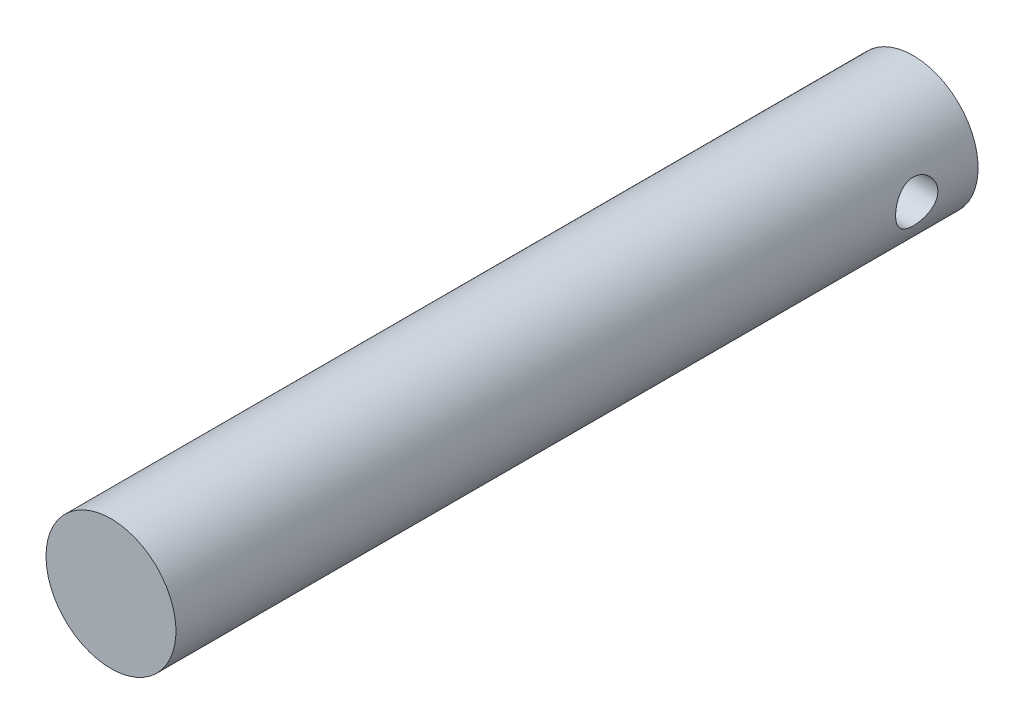
ISO-10303-21;
HEADER;
FILE_DESCRIPTION(('STEP AP214'),'2;1');
FILE_NAME('part.step','',(''),(''),'','','');
FILE_SCHEMA(('AUTOMOTIVE_DESIGN { 1 0 10303 214 1 1 1 1 }'));
ENDSEC;
DATA;
#1=APPLICATION_CONTEXT('core data for automotive mechanical design processes');
#2=APPLICATION_PROTOCOL_DEFINITION('international standard','automotive_design',2000,#1);
#3=PRODUCT_CONTEXT('',#1,'mechanical');
#4=PRODUCT('Part','Part','',(#3));
#5=PRODUCT_RELATED_PRODUCT_CATEGORY('part','',(#4));
#6=PRODUCT_DEFINITION_FORMATION('','',#4);
#7=PRODUCT_DEFINITION_CONTEXT('part definition',#1,'design');
#8=PRODUCT_DEFINITION('design','',#6,#7);
#9=PRODUCT_DEFINITION_SHAPE('','',#8);
#10=(LENGTH_UNIT() NAMED_UNIT(*) SI_UNIT(.MILLI.,.METRE.));
#11=(NAMED_UNIT(*) PLANE_ANGLE_UNIT() SI_UNIT($,.RADIAN.));
#12=(NAMED_UNIT(*) SI_UNIT($,.STERADIAN.) SOLID_ANGLE_UNIT());
#13=UNCERTAINTY_MEASURE_WITH_UNIT(LENGTH_MEASURE(1.E-05),#10,'distance_accuracy_value','');
#14=(GEOMETRIC_REPRESENTATION_CONTEXT(3) GLOBAL_UNCERTAINTY_ASSIGNED_CONTEXT((#13)) GLOBAL_UNIT_ASSIGNED_CONTEXT((#10,
#11,#12)) REPRESENTATION_CONTEXT('',''));
#15=CARTESIAN_POINT('',(0.,0.,0.));
#16=DIRECTION('',(0.,0.,1.));
#17=DIRECTION('',(1.,0.,0.));
#18=AXIS2_PLACEMENT_3D('',#15,#16,#17);
#19=CARTESIAN_POINT('',(27.0642201834863,0.458715596330286,9.45));
#20=DIRECTION('',(-1.,0.,0.));
#21=DIRECTION('',(0.,-1.,0.));
#22=AXIS2_PLACEMENT_3D('',#19,#20,#21);
#23=CYLINDRICAL_SURFACE('',#22,3.25);
#24=CARTESIAN_POINT('',(-7.3929199762026,-2.79128440366972,9.45));
#25=CARTESIAN_POINT('',(-7.39292013626799,-2.79128436961392,9.27270046901606));
#26=CARTESIAN_POINT('',(-7.39796043205219,-2.77672674277918,9.09539892094154));
#27=CARTESIAN_POINT('',(-7.4174787162544,-2.71906503754177,8.74603076756202));
#28=CARTESIAN_POINT('',(-7.43195865483701,-2.67595506039255,8.57396525167484));
#29=CARTESIAN_POINT('',(-7.46854666387884,-2.56284849130752,8.24018388203441));
#30=CARTESIAN_POINT('',(-7.49064037282979,-2.49290249098868,8.07844921766033));
#31=CARTESIAN_POINT('',(-7.53994601332036,-2.32828059755946,7.76896071185041));
#32=CARTESIAN_POINT('',(-7.56715898480589,-2.23359967818443,7.62120972029238));
#33=CARTESIAN_POINT('',(-7.62477158225799,-2.01842544778834,7.33838979785957));
#34=CARTESIAN_POINT('',(-7.65524773936334,-1.89716912063444,7.20391682889129));
#35=CARTESIAN_POINT('',(-7.71530418536026,-1.63391624861526,6.95681103287539));
#36=CARTESIAN_POINT('',(-7.74488433767103,-1.49191656079276,6.84418152149766));
#37=CARTESIAN_POINT('',(-7.80069763932119,-1.18688043163265,6.64128599405659));
#38=CARTESIAN_POINT('',(-7.82683024477067,-1.02341152173962,6.55164006185954));
#39=CARTESIAN_POINT('',(-7.87190555834753,-0.682720731607397,6.40135103812108));
#40=CARTESIAN_POINT('',(-7.89085010246542,-0.505502377230003,6.3407005394716));
#41=CARTESIAN_POINT('',(-7.91887282914443,-0.148588379133641,6.25213232094274));
#42=CARTESIAN_POINT('',(-7.92825772512036,0.0308296290530115,6.22319461868941));
#43=CARTESIAN_POINT('',(-7.93719023979821,0.392203558707344,6.19563491437338));
#44=CARTESIAN_POINT('',(-7.93674027185251,0.574158846606483,6.19700547504368));
#45=CARTESIAN_POINT('',(-7.92626393447129,0.928239367780362,6.22936664277708));
#46=CARTESIAN_POINT('',(-7.91659546846395,1.10047807927065,6.25925027520472));
#47=CARTESIAN_POINT('',(-7.8892141109913,1.43734784273191,6.34596450826688));
#48=CARTESIAN_POINT('',(-7.87150068184341,1.6019783854029,6.40279691002511));
#49=CARTESIAN_POINT('',(-7.82955392853232,1.92143319389194,6.54246788619951));
#50=CARTESIAN_POINT('',(-7.80524007839473,2.07610502757276,6.62562992090305));
#51=CARTESIAN_POINT('',(-7.75263597575973,2.36963252761695,6.81533589512239));
#52=CARTESIAN_POINT('',(-7.7243446577082,2.50848393762124,6.92188610458166));
#53=CARTESIAN_POINT('',(-7.66528087723099,2.77302109017597,7.16096532733197));
#54=CARTESIAN_POINT('',(-7.63445404645545,2.89783600569689,7.29444583071594));
#55=CARTESIAN_POINT('',(-7.57487468023917,3.12358249988415,7.58071709051935));
#56=CARTESIAN_POINT('',(-7.54612243286955,3.22451076613356,7.73351052060549));
#57=CARTESIAN_POINT('',(-7.49365937239887,3.40074497646327,8.0567074724905));
#58=CARTESIAN_POINT('',(-7.47001872572476,3.47570190236825,8.22731355803904));
#59=CARTESIAN_POINT('',(-7.43127175999179,3.59553653752626,8.57968467708717));
#60=CARTESIAN_POINT('',(-7.41616207482116,3.64042611193604,8.76144527785337));
#61=CARTESIAN_POINT('',(-7.39694360647109,3.69711680184614,9.12256753947857));
#62=CARTESIAN_POINT('',(-7.39238851032532,3.71026137166688,9.30169462313214));
#63=CARTESIAN_POINT('',(-7.39355081180836,3.70688065875625,9.6596163017298));
#64=CARTESIAN_POINT('',(-7.39926645986521,3.6903604292814,9.83841094810954));
#65=CARTESIAN_POINT('',(-7.41988302407335,3.62932366823365,10.1846159003382));
#66=CARTESIAN_POINT('',(-7.43448326821247,3.585722644199,10.3522074123555));
#67=CARTESIAN_POINT('',(-7.47089813486508,3.47285085712089,10.6776684406784));
#68=CARTESIAN_POINT('',(-7.49271399566835,3.40357568782797,10.8355362827609));
#69=CARTESIAN_POINT('',(-7.54192703257769,3.23891588668703,11.1424031656331));
#70=CARTESIAN_POINT('',(-7.56947418036762,3.14279917528627,11.2909846957242));
#71=CARTESIAN_POINT('',(-7.6267470739172,2.92802441590994,11.57039723434));
#72=CARTESIAN_POINT('',(-7.65647342968754,2.80936004141031,11.7012232432378));
#73=CARTESIAN_POINT('',(-7.71638695617673,2.54646067659629,11.9475409341215));
#74=CARTESIAN_POINT('',(-7.74653384658704,2.4013098260897,12.0620676291344));
#75=CARTESIAN_POINT('',(-7.80255437836136,2.09311291251823,12.2651905627234));
#76=CARTESIAN_POINT('',(-7.82842819174669,1.9300675702722,12.3537878452513));
#77=CARTESIAN_POINT('',(-7.87285427301752,1.59160905936637,12.5017060515473));
#78=CARTESIAN_POINT('',(-7.89145656175391,1.41629053439835,12.5612277210383));
#79=CARTESIAN_POINT('',(-7.91946153719822,1.05741313093947,12.6497164245844));
#80=CARTESIAN_POINT('',(-7.92886736313032,0.873857086729256,12.6786938852076));
#81=CARTESIAN_POINT('',(-7.9371943909638,0.512563934662732,12.7043699260475));
#82=CARTESIAN_POINT('',(-7.93656665928046,0.334934799857597,12.7024571588678));
#83=CARTESIAN_POINT('',(-7.92599542520976,-0.0173544111411527,12.6698051205653));
#84=CARTESIAN_POINT('',(-7.91605261665348,-0.192014707481419,12.6390679964171));
#85=CARTESIAN_POINT('',(-7.88812483523403,-0.530905291245797,12.5505467817384));
#86=CARTESIAN_POINT('',(-7.8702582835958,-0.695249910538243,12.493160393528));
#87=CARTESIAN_POINT('',(-7.82832316684493,-1.01204857167365,12.3533338794934));
#88=CARTESIAN_POINT('',(-7.80425350069405,-1.16450049632679,12.2708893054336));
#89=CARTESIAN_POINT('',(-7.75133359812995,-1.45912629521035,12.079885547409));
#90=CARTESIAN_POINT('',(-7.72234316695885,-1.60073752664829,11.9704977923889));
#91=CARTESIAN_POINT('',(-7.66321536278516,-1.86405070478737,11.7301430948717));
#92=CARTESIAN_POINT('',(-7.63307763533645,-1.98574643624046,11.5991694413247));
#93=CARTESIAN_POINT('',(-7.57374495599372,-2.21029728094684,11.3136121890246));
#94=CARTESIAN_POINT('',(-7.54462510265698,-2.31229785605587,11.1583389274685));
#95=CARTESIAN_POINT('',(-7.49200540491253,-2.48866743841951,10.8319590568589));
#96=CARTESIAN_POINT('',(-7.46850375613788,-2.56304532135717,10.6608575558233));
#97=CARTESIAN_POINT('',(-7.43128316465382,-2.67797934819477,10.3184579158953));
#98=CARTESIAN_POINT('',(-7.41705112705169,-2.72033545765619,10.1478200907958));
#99=CARTESIAN_POINT('',(-7.39787085473747,-2.77698376646238,9.80145446911807));
#100=CARTESIAN_POINT('',(-7.39291981755579,-2.7912844374237,9.6257282253072));
#101=CARTESIAN_POINT('',(-7.3929199762026,-2.79128440366972,9.45));
#102=B_SPLINE_CURVE_WITH_KNOTS('',3,(#24,#25,#26,#27,#28,#29,#30,#31,#32,#33,#34,#35,#36,#37,
#38,#39,#40,#41,#42,#43,#44,#45,#46,#47,#48,#49,#50,#51,#52,#53,#54,#55,#56,#57,#58,#59,#60,#61,
#62,#63,#64,#65,#66,#67,#68,#69,#70,#71,#72,#73,#74,#75,#76,#77,#78,#79,#80,#81,#82,#83,#84,#85,
#86,#87,#88,#89,#90,#91,#92,#93,#94,#95,#96,#97,#98,#99,#100,#101),.UNSPECIFIED.,.T.,.F.,(4,2,2,
2,2,2,2,2,2,2,2,2,2,2,2,2,2,2,2,2,2,2,2,2,2,2,2,2,2,2,2,2,2,2,2,2,2,2,4),(0.,0.531248505037184,
1.06260679711988,1.59296824911441,2.12343755726667,2.67180188546718,3.22024938614486,
3.7822237298498,4.34405443604298,4.88723029743207,5.43027287176745,5.95305557209682,
6.47587321758633,7.00538064397247,7.53503019539512,8.08845610905501,8.64195872265875,
9.20263474595129,9.76308938511448,10.2993744444867,10.8355681589328,11.3545536787972,
11.8736283092985,12.4085390846316,12.9436001698433,13.5029364155139,14.0622501384863,
14.6176456234264,15.1728514571604,15.7031706450783,16.2334503354496,16.7560588347683,
17.278760159833,17.8201569265527,18.3617223320029,18.9231471315414,19.4843913784856,
20.0110907944363,20.5376311438056),.UNSPECIFIED.);
#103=CARTESIAN_POINT('',(-7.3929199762026,-2.79128440366972,9.45));
#104=VERTEX_POINT('',#103);
#105=EDGE_CURVE('E43',#104,#104,#102,.T.);
#106=ORIENTED_EDGE('',*,*,#105,.F.);
#107=EDGE_LOOP('',(#106));
#108=FACE_BOUND('',#107,.T.);
#109=CARTESIAN_POINT('',(11.5213603431751,-2.79128440366972,9.45));
#110=CARTESIAN_POINT('',(11.5213605032405,-2.79128436961392,9.62729953098394));
#111=CARTESIAN_POINT('',(11.5264007990247,-2.77672674277918,9.80460107905846));
#112=CARTESIAN_POINT('',(11.5459190832269,-2.71906503754177,10.153969232438));
#113=CARTESIAN_POINT('',(11.5603990218095,-2.67595506039255,10.3260347483252));
#114=CARTESIAN_POINT('',(11.5969870308514,-2.56284849130752,10.6598161179656));
#115=CARTESIAN_POINT('',(11.6190807398023,-2.49290249098867,10.8215507823397));
#116=CARTESIAN_POINT('',(11.6683863802929,-2.32828059755946,11.1310392881496));
#117=CARTESIAN_POINT('',(11.6955993517784,-2.23359967818443,11.2787902797076));
#118=CARTESIAN_POINT('',(11.7532119492305,-2.01842544778834,11.5616102021404));
#119=CARTESIAN_POINT('',(11.7836881063359,-1.89716912063444,11.6960831711087));
#120=CARTESIAN_POINT('',(11.8437445523328,-1.63391624861525,11.9431889671246));
#121=CARTESIAN_POINT('',(11.8733247046436,-1.49191656079275,12.0558184785023));
#122=CARTESIAN_POINT('',(11.9291380062937,-1.18688043163264,12.2587140059434));
#123=CARTESIAN_POINT('',(11.9552706117432,-1.02341152173961,12.3483599381405));
#124=CARTESIAN_POINT('',(12.0003459253201,-0.682720731607393,12.4986489618789));
#125=CARTESIAN_POINT('',(12.019290469438,-0.505502377229998,12.5592994605284));
#126=CARTESIAN_POINT('',(12.047313196117,-0.148588379133637,12.6478676790573));
#127=CARTESIAN_POINT('',(12.0566980920929,0.0308296290530157,12.6768053813106));
#128=CARTESIAN_POINT('',(12.0656306067707,0.392203558707348,12.7043650856266));
#129=CARTESIAN_POINT('',(12.065180638825,0.574158846606487,12.7029945249563));
#130=CARTESIAN_POINT('',(12.0547043014438,0.928239367780365,12.6706333572229));
#131=CARTESIAN_POINT('',(12.0450358354365,1.10047807927065,12.6407497247953));
#132=CARTESIAN_POINT('',(12.0176544779638,1.43734784273191,12.5540354917331));
#133=CARTESIAN_POINT('',(11.9999410488159,1.60197838540291,12.4972030899749));
#134=CARTESIAN_POINT('',(11.9579942955049,1.92143319389194,12.3575321138005));
#135=CARTESIAN_POINT('',(11.9336804453673,2.07610502757276,12.274370079097));
#136=CARTESIAN_POINT('',(11.8810763427323,2.36963252761695,12.0846641048776));
#137=CARTESIAN_POINT('',(11.8527850246807,2.50848393762124,11.9781138954183));
#138=CARTESIAN_POINT('',(11.7937212442035,2.77302109017598,11.739034672668));
#139=CARTESIAN_POINT('',(11.762894413428,2.89783600569689,11.6055541692841));
#140=CARTESIAN_POINT('',(11.7033150472117,3.12358249988415,11.3192829094806));
#141=CARTESIAN_POINT('',(11.6745627998421,3.22451076613356,11.1664894793945));
#142=CARTESIAN_POINT('',(11.6220997393714,3.40074497646327,10.8432925275095));
#143=CARTESIAN_POINT('',(11.5984590926973,3.47570190236825,10.672686441961));
#144=CARTESIAN_POINT('',(11.5597121269643,3.59553653752626,10.3203153229128));
#145=CARTESIAN_POINT('',(11.5446024417937,3.64042611193604,10.1385547221466));
#146=CARTESIAN_POINT('',(11.5253839734436,3.69711680184615,9.77743246052143));
#147=CARTESIAN_POINT('',(11.5208288772978,3.71026137166689,9.59830537686786));
#148=CARTESIAN_POINT('',(11.5219911787809,3.70688065875625,9.2403836982702));
#149=CARTESIAN_POINT('',(11.5277068268377,3.6903604292814,9.06158905189046));
#150=CARTESIAN_POINT('',(11.5483233910459,3.62932366823365,8.7153840996618));
#151=CARTESIAN_POINT('',(11.562923635185,3.585722644199,8.54779258764446));
#152=CARTESIAN_POINT('',(11.5993385018376,3.4728508571209,8.22233155932164));
#153=CARTESIAN_POINT('',(11.6211543626409,3.40357568782797,8.06446371723909));
#154=CARTESIAN_POINT('',(11.6703673995502,3.23891588668703,7.7575968343669));
#155=CARTESIAN_POINT('',(11.6979145473402,3.14279917528628,7.60901530427584));
#156=CARTESIAN_POINT('',(11.7551874408897,2.92802441590994,7.32960276565997));
#157=CARTESIAN_POINT('',(11.7849137966601,2.80936004141031,7.19877675676222));
#158=CARTESIAN_POINT('',(11.8448273231493,2.54646067659629,6.95245906587849));
#159=CARTESIAN_POINT('',(11.8749742135596,2.4013098260897,6.83793237086563));
#160=CARTESIAN_POINT('',(11.9309947453339,2.09311291251823,6.63480943727656));
#161=CARTESIAN_POINT('',(11.9568685587192,1.9300675702722,6.54621215474873));
#162=CARTESIAN_POINT('',(12.0012946399901,1.59160905936637,6.39829394845271));
#163=CARTESIAN_POINT('',(12.0198969287264,1.41629053439835,6.3387722789617));
#164=CARTESIAN_POINT('',(12.0479019041708,1.05741313093948,6.25028357541559));
#165=CARTESIAN_POINT('',(12.0573077301029,0.873857086729257,6.22130611479243));
#166=CARTESIAN_POINT('',(12.0656347579363,0.512563934662734,6.1956300739525));
#167=CARTESIAN_POINT('',(12.065007026253,0.334934799857598,6.19754284113222));
#168=CARTESIAN_POINT('',(12.0544357921823,-0.0173544111411512,6.2301948794347));
#169=CARTESIAN_POINT('',(12.044492983626,-0.192014707481418,6.26093200358289));
#170=CARTESIAN_POINT('',(12.0165652022066,-0.530905291245795,6.34945321826155));
#171=CARTESIAN_POINT('',(11.9986986505683,-0.695249910538241,6.40683960647199));
#172=CARTESIAN_POINT('',(11.9567635338175,-1.01204857167364,6.54666612050663));
#173=CARTESIAN_POINT('',(11.9326938676666,-1.16450049632679,6.6291106945664));
#174=CARTESIAN_POINT('',(11.8797739651025,-1.45912629521035,6.82011445259098));
#175=CARTESIAN_POINT('',(11.8507835339314,-1.60073752664829,6.92950220761107));
#176=CARTESIAN_POINT('',(11.7916557297577,-1.86405070478736,7.16985690512825));
#177=CARTESIAN_POINT('',(11.761518002309,-1.98574643624046,7.30083055867531));
#178=CARTESIAN_POINT('',(11.7021853229663,-2.21029728094683,7.58638781097536));
#179=CARTESIAN_POINT('',(11.6730654696295,-2.31229785605587,7.74166107253147));
#180=CARTESIAN_POINT('',(11.6204457718851,-2.48866743841951,8.06804094314108));
#181=CARTESIAN_POINT('',(11.5969441231104,-2.56304532135717,8.23914244417666));
#182=CARTESIAN_POINT('',(11.5597235316264,-2.67797934819477,8.5815420841047));
#183=CARTESIAN_POINT('',(11.5454914940242,-2.72033545765619,8.7521799092042));
#184=CARTESIAN_POINT('',(11.52631122171,-2.77698376646237,9.09854553088193));
#185=CARTESIAN_POINT('',(11.5213601845283,-2.79128443742369,9.27427177469279));
#186=CARTESIAN_POINT('',(11.5213603431751,-2.79128440366972,9.45));
#187=B_SPLINE_CURVE_WITH_KNOTS('',3,(#109,#110,#111,#112,#113,#114,#115,#116,#117,#118,#119,
#120,#121,#122,#123,#124,#125,#126,#127,#128,#129,#130,#131,#132,#133,#134,#135,#136,#137,#138,
#139,#140,#141,#142,#143,#144,#145,#146,#147,#148,#149,#150,#151,#152,#153,#154,#155,#156,#157,
#158,#159,#160,#161,#162,#163,#164,#165,#166,#167,#168,#169,#170,#171,#172,#173,#174,#175,#176,
#177,#178,#179,#180,#181,#182,#183,#184,#185,#186),.UNSPECIFIED.,.T.,.F.,(4,2,2,2,2,2,2,2,2,2,2,
2,2,2,2,2,2,2,2,2,2,2,2,2,2,2,2,2,2,2,2,2,2,2,2,2,2,2,4),(0.,0.531248505037184,1.06260679711988,
1.59296824911441,2.12343755726667,2.67180188546718,3.22024938614486,3.7822237298498,
4.34405443604299,4.88723029743207,5.43027287176745,5.95305557209681,6.47587321758633,
7.00538064397247,7.53503019539512,8.08845610905501,8.64195872265875,9.20263474595129,
9.76308938511448,10.2993744444867,10.8355681589328,11.3545536787972,11.8736283092985,
12.4085390846316,12.9436001698433,13.5029364155139,14.0622501384863,14.6176456234264,
15.1728514571604,15.7031706450783,16.2334503354496,16.7560588347683,17.278760159833,
17.8201569265527,18.3617223320029,18.9231471315414,19.4843913784856,20.0110907944363,
20.5376311438056),.UNSPECIFIED.);
#188=CARTESIAN_POINT('',(11.5213603431751,-2.79128440366972,9.45));
#189=VERTEX_POINT('',#188);
#190=EDGE_CURVE('E11',#189,#189,#187,.T.);
#191=ORIENTED_EDGE('',*,*,#190,.F.);
#192=EDGE_LOOP('',(#191));
#193=FACE_BOUND('',#192,.T.);
#194=ADVANCED_FACE('F31',(#108,#193),#23,.F.);
#195=CARTESIAN_POINT('',(2.06422018348627,0.458715596330279,123.5));
#196=DIRECTION('',(0.,0.,-1.));
#197=DIRECTION('',(-1.,0.,0.));
#198=AXIS2_PLACEMENT_3D('',#195,#196,#197);
#199=CYLINDRICAL_SURFACE('',#198,10.);
#200=CARTESIAN_POINT('',(2.06422018348627,0.458715596330279,123.5));
#201=DIRECTION('',(0.,0.,-1.));
#202=DIRECTION('',(-1.,0.,0.));
#203=AXIS2_PLACEMENT_3D('',#200,#201,#202);
#204=CIRCLE('',#203,10.);
#205=CARTESIAN_POINT('',(-7.93577981651373,0.458715596330279,123.5));
#206=VERTEX_POINT('',#205);
#207=EDGE_CURVE('E47',#206,#206,#204,.T.);
#208=ORIENTED_EDGE('',*,*,#207,.T.);
#209=EDGE_LOOP('',(#208));
#210=FACE_BOUND('',#209,.T.);
#211=CARTESIAN_POINT('',(2.06422018348627,0.458715596330279,0.));
#212=DIRECTION('',(0.,0.,-1.));
#213=DIRECTION('',(-1.,0.,0.));
#214=AXIS2_PLACEMENT_3D('',#211,#212,#213);
#215=CIRCLE('',#214,10.);
#216=CARTESIAN_POINT('',(-7.93577981651373,0.458715596330279,0.));
#217=VERTEX_POINT('',#216);
#218=EDGE_CURVE('E51',#217,#217,#215,.T.);
#219=ORIENTED_EDGE('',*,*,#218,.F.);
#220=EDGE_LOOP('',(#219));
#221=FACE_BOUND('',#220,.T.);
#222=ORIENTED_EDGE('',*,*,#105,.T.);
#223=EDGE_LOOP('',(#222));
#224=FACE_BOUND('',#223,.T.);
#225=ORIENTED_EDGE('',*,*,#190,.T.);
#226=EDGE_LOOP('',(#225));
#227=FACE_BOUND('',#226,.T.);
#228=ADVANCED_FACE('F58',(#210,#221,#224,#227),#199,.T.);
#229=CARTESIAN_POINT('',(0.,0.,0.));
#230=DIRECTION('',(0.,0.,1.));
#231=DIRECTION('',(1.,0.,0.));
#232=AXIS2_PLACEMENT_3D('',#229,#230,#231);
#233=PLANE('',#232);
#234=ORIENTED_EDGE('',*,*,#218,.T.);
#235=EDGE_LOOP('',(#234));
#236=FACE_BOUND('',#235,.T.);
#237=ADVANCED_FACE('F33',(#236),#233,.F.);
#238=CARTESIAN_POINT('',(0.,0.,123.5));
#239=DIRECTION('',(0.,0.,1.));
#240=DIRECTION('',(1.,0.,0.));
#241=AXIS2_PLACEMENT_3D('',#238,#239,#240);
#242=PLANE('',#241);
#243=ORIENTED_EDGE('',*,*,#207,.F.);
#244=EDGE_LOOP('',(#243));
#245=FACE_BOUND('',#244,.T.);
#246=ADVANCED_FACE('F67',(#245),#242,.T.);
#247=CLOSED_SHELL('',(#194,#228,#237,#246));
#248=MANIFOLD_SOLID_BREP('B2',#247);
#249=ADVANCED_BREP_SHAPE_REPRESENTATION('',(#18,#248),#14);
#250=SHAPE_DEFINITION_REPRESENTATION(#9,#249);
ENDSEC;
END-ISO-10303-21;
